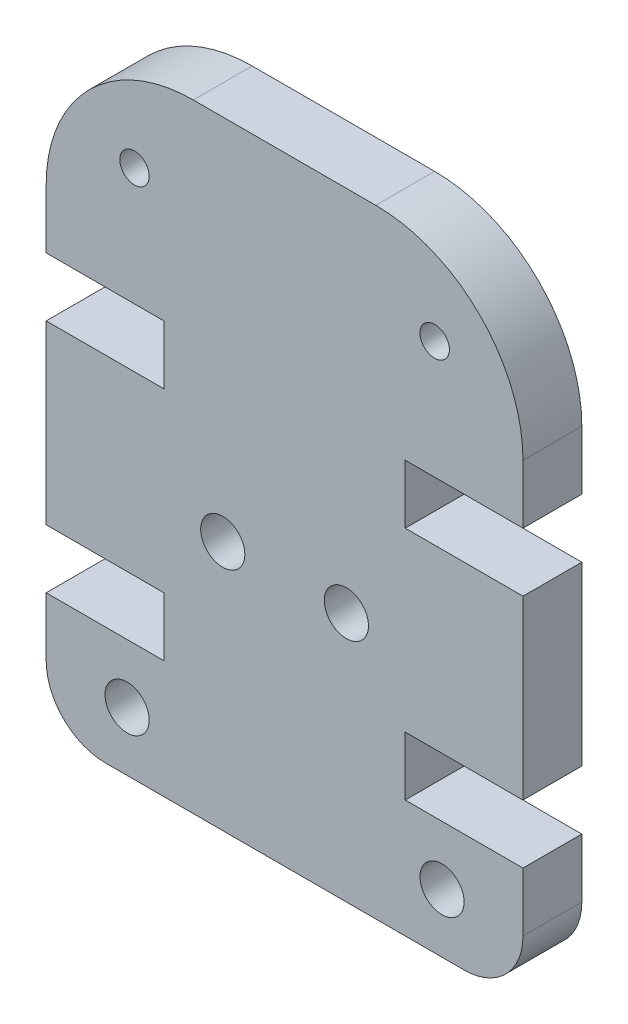
ISO-10303-21;
HEADER;
FILE_DESCRIPTION(('STEP AP214'),'2;1');
FILE_NAME('part.step','',(''),(''),'','','');
FILE_SCHEMA(('AUTOMOTIVE_DESIGN { 1 0 10303 214 1 1 1 1 }'));
ENDSEC;
DATA;
#1=APPLICATION_CONTEXT('core data for automotive mechanical design processes');
#2=APPLICATION_PROTOCOL_DEFINITION('international standard','automotive_design',2000,#1);
#3=PRODUCT_CONTEXT('',#1,'mechanical');
#4=PRODUCT('Part','Part','',(#3));
#5=PRODUCT_RELATED_PRODUCT_CATEGORY('part','',(#4));
#6=PRODUCT_DEFINITION_FORMATION('','',#4);
#7=PRODUCT_DEFINITION_CONTEXT('part definition',#1,'design');
#8=PRODUCT_DEFINITION('design','',#6,#7);
#9=PRODUCT_DEFINITION_SHAPE('','',#8);
#10=(LENGTH_UNIT() NAMED_UNIT(*) SI_UNIT(.MILLI.,.METRE.));
#11=(NAMED_UNIT(*) PLANE_ANGLE_UNIT() SI_UNIT($,.RADIAN.));
#12=(NAMED_UNIT(*) SI_UNIT($,.STERADIAN.) SOLID_ANGLE_UNIT());
#13=UNCERTAINTY_MEASURE_WITH_UNIT(LENGTH_MEASURE(1.E-05),#10,'distance_accuracy_value','');
#14=(GEOMETRIC_REPRESENTATION_CONTEXT(3) GLOBAL_UNCERTAINTY_ASSIGNED_CONTEXT((#13)) GLOBAL_UNIT_ASSIGNED_CONTEXT((#10,
#11,#12)) REPRESENTATION_CONTEXT('',''));
#15=CARTESIAN_POINT('',(0.,0.,0.));
#16=DIRECTION('',(0.,0.,1.));
#17=DIRECTION('',(1.,0.,0.));
#18=AXIS2_PLACEMENT_3D('',#15,#16,#17);
#19=CARTESIAN_POINT('',(5.00000000000002,16.,2.));
#20=DIRECTION('',(0.,0.,1.));
#21=DIRECTION('',(1.,0.,0.));
#22=AXIS2_PLACEMENT_3D('',#19,#20,#21);
#23=PLANE('',#22);
#24=CARTESIAN_POINT('',(13.4500000000022,1.99999999999781,2.));
#25=DIRECTION('',(0.,0.,1.));
#26=DIRECTION('',(1.,0.,0.));
#27=AXIS2_PLACEMENT_3D('',#24,#25,#26);
#28=CIRCLE('',#27,0.75);
#29=CARTESIAN_POINT('',(14.2000000000022,1.99999999999781,2.));
#30=VERTEX_POINT('',#29);
#31=EDGE_CURVE('E455',#30,#30,#28,.T.);
#32=ORIENTED_EDGE('',*,*,#31,.F.);
#33=EDGE_LOOP('',(#32));
#34=FACE_BOUND('',#33,.T.);
#35=CARTESIAN_POINT('',(3.00000000000103,17.9999999999999,2.));
#36=DIRECTION('',(0.,0.,1.));
#37=DIRECTION('',(1.,0.,0.));
#38=AXIS2_PLACEMENT_3D('',#35,#36,#37);
#39=CIRCLE('',#38,0.499999999999945);
#40=CARTESIAN_POINT('',(3.50000000000097,17.9999999999999,2.));
#41=VERTEX_POINT('',#40);
#42=EDGE_CURVE('E467',#41,#41,#39,.T.);
#43=ORIENTED_EDGE('',*,*,#42,.F.);
#44=EDGE_LOOP('',(#43));
#45=FACE_BOUND('',#44,.T.);
#46=CARTESIAN_POINT('',(10.2000000000012,8.5000000000022,2.));
#47=DIRECTION('',(0.,0.,1.));
#48=DIRECTION('',(1.,0.,0.));
#49=AXIS2_PLACEMENT_3D('',#46,#47,#48);
#50=CIRCLE('',#49,0.75);
#51=CARTESIAN_POINT('',(10.9500000000012,8.5000000000022,2.));
#52=VERTEX_POINT('',#51);
#53=EDGE_CURVE('E229',#52,#52,#50,.T.);
#54=ORIENTED_EDGE('',*,*,#53,.F.);
#55=EDGE_LOOP('',(#54));
#56=FACE_BOUND('',#55,.T.);
#57=CARTESIAN_POINT('',(5.00000000000002,16.,2.));
#58=DIRECTION('',(0.,0.,1.));
#59=DIRECTION('',(1.,0.,0.));
#60=AXIS2_PLACEMENT_3D('',#57,#58,#59);
#61=CIRCLE('',#60,5.00000000000001);
#62=CARTESIAN_POINT('',(5.00000000000006,21.,2.));
#63=VERTEX_POINT('',#62);
#64=CARTESIAN_POINT('',(0.,16.,2.));
#65=VERTEX_POINT('',#64);
#66=EDGE_CURVE('E272',#63,#65,#61,.T.);
#67=ORIENTED_EDGE('',*,*,#66,.T.);
#68=DIRECTION('',(0.,-1.,0.));
#69=VECTOR('',#68,1.);
#70=CARTESIAN_POINT('',(0.,16.,2.));
#71=LINE('',#70,#69);
#72=CARTESIAN_POINT('',(0.,14.,2.));
#73=VERTEX_POINT('',#72);
#74=EDGE_CURVE('E140',#65,#73,#71,.T.);
#75=ORIENTED_EDGE('',*,*,#74,.T.);
#76=DIRECTION('',(1.,0.,0.));
#77=VECTOR('',#76,1.);
#78=CARTESIAN_POINT('',(0.,14.,2.));
#79=LINE('',#78,#77);
#80=CARTESIAN_POINT('',(4.00000000000113,14.,2.));
#81=VERTEX_POINT('',#80);
#82=EDGE_CURVE('E335',#73,#81,#79,.T.);
#83=ORIENTED_EDGE('',*,*,#82,.T.);
#84=DIRECTION('',(0.,-1.,0.));
#85=VECTOR('',#84,1.);
#86=CARTESIAN_POINT('',(4.00000000000113,14.,2.));
#87=LINE('',#86,#85);
#88=CARTESIAN_POINT('',(4.00000000000113,12.,2.));
#89=VERTEX_POINT('',#88);
#90=EDGE_CURVE('E354',#81,#89,#87,.T.);
#91=ORIENTED_EDGE('',*,*,#90,.T.);
#92=DIRECTION('',(-1.,0.,0.));
#93=VECTOR('',#92,1.);
#94=CARTESIAN_POINT('',(4.00000000000113,12.,2.));
#95=LINE('',#94,#93);
#96=CARTESIAN_POINT('',(0.,12.,2.));
#97=VERTEX_POINT('',#96);
#98=EDGE_CURVE('E351',#89,#97,#95,.T.);
#99=ORIENTED_EDGE('',*,*,#98,.T.);
#100=DIRECTION('',(0.,-1.,0.));
#101=VECTOR('',#100,1.);
#102=CARTESIAN_POINT('',(0.,12.,2.));
#103=LINE('',#102,#101);
#104=CARTESIAN_POINT('',(0.,5.99999999999998,2.));
#105=VERTEX_POINT('',#104);
#106=EDGE_CURVE('E353',#97,#105,#103,.T.);
#107=ORIENTED_EDGE('',*,*,#106,.T.);
#108=DIRECTION('',(1.,0.,0.));
#109=VECTOR('',#108,1.);
#110=CARTESIAN_POINT('',(0.,5.99999999999998,2.));
#111=LINE('',#110,#109);
#112=CARTESIAN_POINT('',(4.00000000000112,5.99999999999998,2.));
#113=VERTEX_POINT('',#112);
#114=EDGE_CURVE('E356',#105,#113,#111,.T.);
#115=ORIENTED_EDGE('',*,*,#114,.T.);
#116=DIRECTION('',(0.,-1.,0.));
#117=VECTOR('',#116,1.);
#118=CARTESIAN_POINT('',(4.00000000000112,5.99999999999998,2.));
#119=LINE('',#118,#117);
#120=CARTESIAN_POINT('',(4.00000000000112,3.99999999999998,2.));
#121=VERTEX_POINT('',#120);
#122=EDGE_CURVE('E362',#113,#121,#119,.T.);
#123=ORIENTED_EDGE('',*,*,#122,.T.);
#124=DIRECTION('',(-1.,0.,0.));
#125=VECTOR('',#124,1.);
#126=CARTESIAN_POINT('',(4.00000000000112,3.99999999999998,2.));
#127=LINE('',#126,#125);
#128=CARTESIAN_POINT('',(0.,3.99999999999998,2.));
#129=VERTEX_POINT('',#128);
#130=EDGE_CURVE('E364',#121,#129,#127,.T.);
#131=ORIENTED_EDGE('',*,*,#130,.T.);
#132=DIRECTION('',(0.,-1.,0.));
#133=VECTOR('',#132,1.);
#134=CARTESIAN_POINT('',(0.,1.99999999999997,2.));
#135=LINE('',#134,#133);
#136=CARTESIAN_POINT('',(0.,1.99999999999997,2.));
#137=VERTEX_POINT('',#136);
#138=EDGE_CURVE('E366',#129,#137,#135,.T.);
#139=ORIENTED_EDGE('',*,*,#138,.T.);
#140=CARTESIAN_POINT('',(2.00000000000001,1.99999999999997,2.));
#141=DIRECTION('',(0.,0.,1.));
#142=DIRECTION('',(1.,0.,0.));
#143=AXIS2_PLACEMENT_3D('',#140,#141,#142);
#144=CIRCLE('',#143,1.99999999999999);
#145=CARTESIAN_POINT('',(2.,0.,2.));
#146=VERTEX_POINT('',#145);
#147=EDGE_CURVE('E368',#137,#146,#144,.T.);
#148=ORIENTED_EDGE('',*,*,#147,.T.);
#149=DIRECTION('',(1.,0.,0.));
#150=VECTOR('',#149,1.);
#151=CARTESIAN_POINT('',(2.,0.,2.));
#152=LINE('',#151,#150);
#153=CARTESIAN_POINT('',(14.2000000000059,0.,2.));
#154=VERTEX_POINT('',#153);
#155=EDGE_CURVE('E370',#146,#154,#152,.T.);
#156=ORIENTED_EDGE('',*,*,#155,.T.);
#157=CARTESIAN_POINT('',(14.2000000000108,1.99999999999995,2.));
#158=DIRECTION('',(0.,0.,1.));
#159=DIRECTION('',(1.,0.,0.));
#160=AXIS2_PLACEMENT_3D('',#157,#158,#159);
#161=CIRCLE('',#160,1.99999999999997);
#162=CARTESIAN_POINT('',(16.2000000000107,1.99999999999975,2.));
#163=VERTEX_POINT('',#162);
#164=EDGE_CURVE('E372',#154,#163,#161,.T.);
#165=ORIENTED_EDGE('',*,*,#164,.T.);
#166=DIRECTION('',(0.,1.,0.));
#167=VECTOR('',#166,1.);
#168=CARTESIAN_POINT('',(16.2000000000107,1.99999999999975,2.));
#169=LINE('',#168,#167);
#170=CARTESIAN_POINT('',(16.2000000000107,3.99999999999998,2.));
#171=VERTEX_POINT('',#170);
#172=EDGE_CURVE('E374',#163,#171,#169,.T.);
#173=ORIENTED_EDGE('',*,*,#172,.T.);
#174=DIRECTION('',(-1.,0.,0.));
#175=VECTOR('',#174,1.);
#176=CARTESIAN_POINT('',(12.2000000000096,3.99999999999998,2.));
#177=LINE('',#176,#175);
#178=CARTESIAN_POINT('',(12.2000000000096,3.99999999999998,2.));
#179=VERTEX_POINT('',#178);
#180=EDGE_CURVE('E376',#171,#179,#177,.T.);
#181=ORIENTED_EDGE('',*,*,#180,.T.);
#182=DIRECTION('',(0.,1.,0.));
#183=VECTOR('',#182,1.);
#184=CARTESIAN_POINT('',(12.2000000000096,5.99999999999995,2.));
#185=LINE('',#184,#183);
#186=CARTESIAN_POINT('',(12.2000000000096,5.99999999999995,2.));
#187=VERTEX_POINT('',#186);
#188=EDGE_CURVE('E378',#179,#187,#185,.T.);
#189=ORIENTED_EDGE('',*,*,#188,.T.);
#190=DIRECTION('',(1.,0.,0.));
#191=VECTOR('',#190,1.);
#192=CARTESIAN_POINT('',(16.2000000000028,5.99999999999995,2.));
#193=LINE('',#192,#191);
#194=CARTESIAN_POINT('',(16.2000000000028,5.99999999999995,2.));
#195=VERTEX_POINT('',#194);
#196=EDGE_CURVE('E380',#187,#195,#193,.T.);
#197=ORIENTED_EDGE('',*,*,#196,.T.);
#198=DIRECTION('',(0.,1.,0.));
#199=VECTOR('',#198,1.);
#200=CARTESIAN_POINT('',(16.2000000000028,12.,2.));
#201=LINE('',#200,#199);
#202=CARTESIAN_POINT('',(16.2000000000028,12.,2.));
#203=VERTEX_POINT('',#202);
#204=EDGE_CURVE('E382',#195,#203,#201,.T.);
#205=ORIENTED_EDGE('',*,*,#204,.T.);
#206=DIRECTION('',(-1.,0.,0.));
#207=VECTOR('',#206,1.);
#208=CARTESIAN_POINT('',(12.200000000003,12.,2.));
#209=LINE('',#208,#207);
#210=CARTESIAN_POINT('',(12.200000000003,12.,2.));
#211=VERTEX_POINT('',#210);
#212=EDGE_CURVE('E384',#203,#211,#209,.T.);
#213=ORIENTED_EDGE('',*,*,#212,.T.);
#214=DIRECTION('',(0.,1.,0.));
#215=VECTOR('',#214,1.);
#216=CARTESIAN_POINT('',(12.200000000003,14.,2.));
#217=LINE('',#216,#215);
#218=CARTESIAN_POINT('',(12.200000000003,14.,2.));
#219=VERTEX_POINT('',#218);
#220=EDGE_CURVE('E386',#211,#219,#217,.T.);
#221=ORIENTED_EDGE('',*,*,#220,.T.);
#222=DIRECTION('',(1.,0.,0.));
#223=VECTOR('',#222,1.);
#224=CARTESIAN_POINT('',(16.2000000000028,14.,2.));
#225=LINE('',#224,#223);
#226=CARTESIAN_POINT('',(16.2000000000028,14.,2.));
#227=VERTEX_POINT('',#226);
#228=EDGE_CURVE('E207',#219,#227,#225,.T.);
#229=ORIENTED_EDGE('',*,*,#228,.T.);
#230=DIRECTION('',(0.,1.,0.));
#231=VECTOR('',#230,1.);
#232=CARTESIAN_POINT('',(16.2000000000028,16.0000000000002,2.));
#233=LINE('',#232,#231);
#234=CARTESIAN_POINT('',(16.2000000000028,16.0000000000002,2.));
#235=VERTEX_POINT('',#234);
#236=EDGE_CURVE('E201',#227,#235,#233,.T.);
#237=ORIENTED_EDGE('',*,*,#236,.T.);
#238=CARTESIAN_POINT('',(11.2000000000015,15.9999999999986,2.));
#239=DIRECTION('',(0.,0.,1.));
#240=DIRECTION('',(1.,0.,0.));
#241=AXIS2_PLACEMENT_3D('',#238,#239,#240);
#242=CIRCLE('',#241,5.00000000000135);
#243=CARTESIAN_POINT('',(11.2000000000028,21.,2.));
#244=VERTEX_POINT('',#243);
#245=EDGE_CURVE('E205',#235,#244,#242,.T.);
#246=ORIENTED_EDGE('',*,*,#245,.T.);
#247=DIRECTION('',(-1.,0.,0.));
#248=VECTOR('',#247,1.);
#249=CARTESIAN_POINT('',(5.00000000000006,21.,2.));
#250=LINE('',#249,#248);
#251=EDGE_CURVE('E49',#244,#63,#250,.T.);
#252=ORIENTED_EDGE('',*,*,#251,.T.);
#253=EDGE_LOOP('',(#67,#75,#83,#91,#99,#107,#115,#123,#131,#139,#148,#156,#165,#173,#181,#189,
#197,#205,#213,#221,#229,#237,#246,#252));
#254=FACE_BOUND('',#253,.T.);
#255=CARTESIAN_POINT('',(6.00000000000113,8.5000000000022,2.));
#256=DIRECTION('',(0.,0.,1.));
#257=DIRECTION('',(1.,0.,0.));
#258=AXIS2_PLACEMENT_3D('',#255,#256,#257);
#259=CIRCLE('',#258,0.75);
#260=CARTESIAN_POINT('',(6.75000000000113,8.5000000000022,2.));
#261=VERTEX_POINT('',#260);
#262=EDGE_CURVE('E473',#261,#261,#259,.T.);
#263=ORIENTED_EDGE('',*,*,#262,.F.);
#264=EDGE_LOOP('',(#263));
#265=FACE_BOUND('',#264,.T.);
#266=CARTESIAN_POINT('',(13.2000000000014,17.9999999999999,2.));
#267=DIRECTION('',(0.,0.,1.));
#268=DIRECTION('',(1.,0.,0.));
#269=AXIS2_PLACEMENT_3D('',#266,#267,#268);
#270=CIRCLE('',#269,0.500000000000167);
#271=CARTESIAN_POINT('',(13.7000000000015,17.9999999999999,2.));
#272=VERTEX_POINT('',#271);
#273=EDGE_CURVE('E461',#272,#272,#270,.T.);
#274=ORIENTED_EDGE('',*,*,#273,.F.);
#275=EDGE_LOOP('',(#274));
#276=FACE_BOUND('',#275,.T.);
#277=CARTESIAN_POINT('',(2.75000000000094,2.00000000000014,2.));
#278=DIRECTION('',(0.,0.,1.));
#279=DIRECTION('',(1.,0.,0.));
#280=AXIS2_PLACEMENT_3D('',#277,#278,#279);
#281=CIRCLE('',#280,0.75);
#282=CARTESIAN_POINT('',(3.50000000000094,2.00000000000014,2.));
#283=VERTEX_POINT('',#282);
#284=EDGE_CURVE('E446',#283,#283,#281,.T.);
#285=ORIENTED_EDGE('',*,*,#284,.F.);
#286=EDGE_LOOP('',(#285));
#287=FACE_BOUND('',#286,.T.);
#288=ADVANCED_FACE('F32',(#34,#45,#56,#254,#265,#276,#287),#23,.T.);
#289=CARTESIAN_POINT('',(5.00000000000002,16.,0.));
#290=DIRECTION('',(0.,0.,1.));
#291=DIRECTION('',(1.,0.,0.));
#292=AXIS2_PLACEMENT_3D('',#289,#290,#291);
#293=PLANE('',#292);
#294=CARTESIAN_POINT('',(13.4500000000022,1.99999999999781,0.));
#295=DIRECTION('',(0.,0.,1.));
#296=DIRECTION('',(1.,0.,0.));
#297=AXIS2_PLACEMENT_3D('',#294,#295,#296);
#298=CIRCLE('',#297,0.75);
#299=CARTESIAN_POINT('',(14.2000000000022,1.99999999999781,0.));
#300=VERTEX_POINT('',#299);
#301=EDGE_CURVE('E452',#300,#300,#298,.T.);
#302=ORIENTED_EDGE('',*,*,#301,.T.);
#303=EDGE_LOOP('',(#302));
#304=FACE_BOUND('',#303,.T.);
#305=CARTESIAN_POINT('',(3.00000000000103,17.9999999999999,0.));
#306=DIRECTION('',(0.,0.,1.));
#307=DIRECTION('',(1.,0.,0.));
#308=AXIS2_PLACEMENT_3D('',#305,#306,#307);
#309=CIRCLE('',#308,0.499999999999945);
#310=CARTESIAN_POINT('',(3.50000000000097,17.9999999999999,0.));
#311=VERTEX_POINT('',#310);
#312=EDGE_CURVE('E464',#311,#311,#309,.T.);
#313=ORIENTED_EDGE('',*,*,#312,.T.);
#314=EDGE_LOOP('',(#313));
#315=FACE_BOUND('',#314,.T.);
#316=CARTESIAN_POINT('',(10.2000000000012,8.5000000000022,0.));
#317=DIRECTION('',(0.,0.,1.));
#318=DIRECTION('',(1.,0.,0.));
#319=AXIS2_PLACEMENT_3D('',#316,#317,#318);
#320=CIRCLE('',#319,0.75);
#321=CARTESIAN_POINT('',(10.9500000000012,8.5000000000022,0.));
#322=VERTEX_POINT('',#321);
#323=EDGE_CURVE('E476',#322,#322,#320,.T.);
#324=ORIENTED_EDGE('',*,*,#323,.T.);
#325=EDGE_LOOP('',(#324));
#326=FACE_BOUND('',#325,.T.);
#327=CARTESIAN_POINT('',(5.00000000000002,16.,0.));
#328=DIRECTION('',(0.,0.,1.));
#329=DIRECTION('',(1.,0.,0.));
#330=AXIS2_PLACEMENT_3D('',#327,#328,#329);
#331=CIRCLE('',#330,5.00000000000001);
#332=CARTESIAN_POINT('',(5.00000000000006,21.,0.));
#333=VERTEX_POINT('',#332);
#334=CARTESIAN_POINT('',(0.,16.,0.));
#335=VERTEX_POINT('',#334);
#336=EDGE_CURVE('E225',#333,#335,#331,.T.);
#337=ORIENTED_EDGE('',*,*,#336,.F.);
#338=DIRECTION('',(-1.,0.,0.));
#339=VECTOR('',#338,1.);
#340=CARTESIAN_POINT('',(5.00000000000006,21.,0.));
#341=LINE('',#340,#339);
#342=CARTESIAN_POINT('',(11.2000000000028,21.,0.));
#343=VERTEX_POINT('',#342);
#344=EDGE_CURVE('E132',#343,#333,#341,.T.);
#345=ORIENTED_EDGE('',*,*,#344,.F.);
#346=CARTESIAN_POINT('',(11.2000000000015,15.9999999999986,0.));
#347=DIRECTION('',(0.,0.,1.));
#348=DIRECTION('',(1.,0.,0.));
#349=AXIS2_PLACEMENT_3D('',#346,#347,#348);
#350=CIRCLE('',#349,5.00000000000135);
#351=CARTESIAN_POINT('',(16.2000000000028,16.0000000000002,0.));
#352=VERTEX_POINT('',#351);
#353=EDGE_CURVE('E126',#352,#343,#350,.T.);
#354=ORIENTED_EDGE('',*,*,#353,.F.);
#355=DIRECTION('',(0.,1.,0.));
#356=VECTOR('',#355,1.);
#357=CARTESIAN_POINT('',(16.2000000000028,16.0000000000002,0.));
#358=LINE('',#357,#356);
#359=CARTESIAN_POINT('',(16.2000000000028,14.,0.));
#360=VERTEX_POINT('',#359);
#361=EDGE_CURVE('E215',#360,#352,#358,.T.);
#362=ORIENTED_EDGE('',*,*,#361,.F.);
#363=DIRECTION('',(1.,0.,0.));
#364=VECTOR('',#363,1.);
#365=CARTESIAN_POINT('',(16.2000000000028,14.,0.));
#366=LINE('',#365,#364);
#367=CARTESIAN_POINT('',(12.200000000003,14.,0.));
#368=VERTEX_POINT('',#367);
#369=EDGE_CURVE('E267',#368,#360,#366,.T.);
#370=ORIENTED_EDGE('',*,*,#369,.F.);
#371=DIRECTION('',(0.,1.,0.));
#372=VECTOR('',#371,1.);
#373=CARTESIAN_POINT('',(12.200000000003,14.,0.));
#374=LINE('',#373,#372);
#375=CARTESIAN_POINT('',(12.200000000003,12.,0.));
#376=VERTEX_POINT('',#375);
#377=EDGE_CURVE('E265',#376,#368,#374,.T.);
#378=ORIENTED_EDGE('',*,*,#377,.F.);
#379=DIRECTION('',(-1.,0.,0.));
#380=VECTOR('',#379,1.);
#381=CARTESIAN_POINT('',(12.200000000003,12.,0.));
#382=LINE('',#381,#380);
#383=CARTESIAN_POINT('',(16.2000000000028,12.,0.));
#384=VERTEX_POINT('',#383);
#385=EDGE_CURVE('E263',#384,#376,#382,.T.);
#386=ORIENTED_EDGE('',*,*,#385,.F.);
#387=DIRECTION('',(0.,1.,0.));
#388=VECTOR('',#387,1.);
#389=CARTESIAN_POINT('',(16.2000000000028,12.,0.));
#390=LINE('',#389,#388);
#391=CARTESIAN_POINT('',(16.2000000000028,5.99999999999995,0.));
#392=VERTEX_POINT('',#391);
#393=EDGE_CURVE('E261',#392,#384,#390,.T.);
#394=ORIENTED_EDGE('',*,*,#393,.F.);
#395=DIRECTION('',(1.,0.,0.));
#396=VECTOR('',#395,1.);
#397=CARTESIAN_POINT('',(16.2000000000028,5.99999999999995,0.));
#398=LINE('',#397,#396);
#399=CARTESIAN_POINT('',(12.2000000000096,5.99999999999995,0.));
#400=VERTEX_POINT('',#399);
#401=EDGE_CURVE('E259',#400,#392,#398,.T.);
#402=ORIENTED_EDGE('',*,*,#401,.F.);
#403=DIRECTION('',(0.,1.,0.));
#404=VECTOR('',#403,1.);
#405=CARTESIAN_POINT('',(12.2000000000096,5.99999999999995,0.));
#406=LINE('',#405,#404);
#407=CARTESIAN_POINT('',(12.2000000000096,3.99999999999998,0.));
#408=VERTEX_POINT('',#407);
#409=EDGE_CURVE('E257',#408,#400,#406,.T.);
#410=ORIENTED_EDGE('',*,*,#409,.F.);
#411=DIRECTION('',(-1.,0.,0.));
#412=VECTOR('',#411,1.);
#413=CARTESIAN_POINT('',(12.2000000000096,3.99999999999998,0.));
#414=LINE('',#413,#412);
#415=CARTESIAN_POINT('',(16.2000000000107,3.99999999999998,0.));
#416=VERTEX_POINT('',#415);
#417=EDGE_CURVE('E255',#416,#408,#414,.T.);
#418=ORIENTED_EDGE('',*,*,#417,.F.);
#419=DIRECTION('',(0.,1.,0.));
#420=VECTOR('',#419,1.);
#421=CARTESIAN_POINT('',(16.2000000000107,1.99999999999975,0.));
#422=LINE('',#421,#420);
#423=CARTESIAN_POINT('',(16.2000000000107,1.99999999999975,0.));
#424=VERTEX_POINT('',#423);
#425=EDGE_CURVE('E253',#424,#416,#422,.T.);
#426=ORIENTED_EDGE('',*,*,#425,.F.);
#427=CARTESIAN_POINT('',(14.2000000000108,1.99999999999995,0.));
#428=DIRECTION('',(0.,0.,1.));
#429=DIRECTION('',(1.,0.,0.));
#430=AXIS2_PLACEMENT_3D('',#427,#428,#429);
#431=CIRCLE('',#430,1.99999999999997);
#432=CARTESIAN_POINT('',(14.2000000000059,0.,0.));
#433=VERTEX_POINT('',#432);
#434=EDGE_CURVE('E251',#433,#424,#431,.T.);
#435=ORIENTED_EDGE('',*,*,#434,.F.);
#436=DIRECTION('',(1.,0.,0.));
#437=VECTOR('',#436,1.);
#438=CARTESIAN_POINT('',(2.,0.,0.));
#439=LINE('',#438,#437);
#440=CARTESIAN_POINT('',(2.,0.,0.));
#441=VERTEX_POINT('',#440);
#442=EDGE_CURVE('E249',#441,#433,#439,.T.);
#443=ORIENTED_EDGE('',*,*,#442,.F.);
#444=CARTESIAN_POINT('',(2.00000000000001,1.99999999999997,0.));
#445=DIRECTION('',(0.,0.,1.));
#446=DIRECTION('',(1.,0.,0.));
#447=AXIS2_PLACEMENT_3D('',#444,#445,#446);
#448=CIRCLE('',#447,1.99999999999999);
#449=CARTESIAN_POINT('',(0.,1.99999999999997,0.));
#450=VERTEX_POINT('',#449);
#451=EDGE_CURVE('E247',#450,#441,#448,.T.);
#452=ORIENTED_EDGE('',*,*,#451,.F.);
#453=DIRECTION('',(0.,-1.,0.));
#454=VECTOR('',#453,1.);
#455=CARTESIAN_POINT('',(0.,1.99999999999997,0.));
#456=LINE('',#455,#454);
#457=CARTESIAN_POINT('',(0.,3.99999999999998,0.));
#458=VERTEX_POINT('',#457);
#459=EDGE_CURVE('E245',#458,#450,#456,.T.);
#460=ORIENTED_EDGE('',*,*,#459,.F.);
#461=DIRECTION('',(-1.,0.,0.));
#462=VECTOR('',#461,1.);
#463=CARTESIAN_POINT('',(4.00000000000112,3.99999999999998,0.));
#464=LINE('',#463,#462);
#465=CARTESIAN_POINT('',(4.00000000000112,3.99999999999998,0.));
#466=VERTEX_POINT('',#465);
#467=EDGE_CURVE('E243',#466,#458,#464,.T.);
#468=ORIENTED_EDGE('',*,*,#467,.F.);
#469=DIRECTION('',(0.,-1.,0.));
#470=VECTOR('',#469,1.);
#471=CARTESIAN_POINT('',(4.00000000000112,5.99999999999998,0.));
#472=LINE('',#471,#470);
#473=CARTESIAN_POINT('',(4.00000000000112,5.99999999999998,0.));
#474=VERTEX_POINT('',#473);
#475=EDGE_CURVE('E241',#474,#466,#472,.T.);
#476=ORIENTED_EDGE('',*,*,#475,.F.);
#477=DIRECTION('',(1.,0.,0.));
#478=VECTOR('',#477,1.);
#479=CARTESIAN_POINT('',(0.,5.99999999999998,0.));
#480=LINE('',#479,#478);
#481=CARTESIAN_POINT('',(0.,5.99999999999998,0.));
#482=VERTEX_POINT('',#481);
#483=EDGE_CURVE('E239',#482,#474,#480,.T.);
#484=ORIENTED_EDGE('',*,*,#483,.F.);
#485=DIRECTION('',(0.,-1.,0.));
#486=VECTOR('',#485,1.);
#487=CARTESIAN_POINT('',(0.,12.,0.));
#488=LINE('',#487,#486);
#489=CARTESIAN_POINT('',(0.,12.,0.));
#490=VERTEX_POINT('',#489);
#491=EDGE_CURVE('E237',#490,#482,#488,.T.);
#492=ORIENTED_EDGE('',*,*,#491,.F.);
#493=DIRECTION('',(-1.,0.,0.));
#494=VECTOR('',#493,1.);
#495=CARTESIAN_POINT('',(4.00000000000113,12.,0.));
#496=LINE('',#495,#494);
#497=CARTESIAN_POINT('',(4.00000000000113,12.,0.));
#498=VERTEX_POINT('',#497);
#499=EDGE_CURVE('E235',#498,#490,#496,.T.);
#500=ORIENTED_EDGE('',*,*,#499,.F.);
#501=DIRECTION('',(0.,-1.,0.));
#502=VECTOR('',#501,1.);
#503=CARTESIAN_POINT('',(4.00000000000113,14.,0.));
#504=LINE('',#503,#502);
#505=CARTESIAN_POINT('',(4.00000000000113,14.,0.));
#506=VERTEX_POINT('',#505);
#507=EDGE_CURVE('E233',#506,#498,#504,.T.);
#508=ORIENTED_EDGE('',*,*,#507,.F.);
#509=DIRECTION('',(1.,0.,0.));
#510=VECTOR('',#509,1.);
#511=CARTESIAN_POINT('',(0.,14.,0.));
#512=LINE('',#511,#510);
#513=CARTESIAN_POINT('',(0.,14.,0.));
#514=VERTEX_POINT('',#513);
#515=EDGE_CURVE('E231',#514,#506,#512,.T.);
#516=ORIENTED_EDGE('',*,*,#515,.F.);
#517=DIRECTION('',(0.,-1.,0.));
#518=VECTOR('',#517,1.);
#519=CARTESIAN_POINT('',(0.,16.,0.));
#520=LINE('',#519,#518);
#521=EDGE_CURVE('E228',#335,#514,#520,.T.);
#522=ORIENTED_EDGE('',*,*,#521,.F.);
#523=EDGE_LOOP('',(#337,#345,#354,#362,#370,#378,#386,#394,#402,#410,#418,#426,#435,#443,#452,
#460,#468,#476,#484,#492,#500,#508,#516,#522));
#524=FACE_BOUND('',#523,.T.);
#525=CARTESIAN_POINT('',(6.00000000000113,8.5000000000022,0.));
#526=DIRECTION('',(0.,0.,1.));
#527=DIRECTION('',(1.,0.,0.));
#528=AXIS2_PLACEMENT_3D('',#525,#526,#527);
#529=CIRCLE('',#528,0.75);
#530=CARTESIAN_POINT('',(6.75000000000113,8.5000000000022,0.));
#531=VERTEX_POINT('',#530);
#532=EDGE_CURVE('E470',#531,#531,#529,.T.);
#533=ORIENTED_EDGE('',*,*,#532,.T.);
#534=EDGE_LOOP('',(#533));
#535=FACE_BOUND('',#534,.T.);
#536=CARTESIAN_POINT('',(13.2000000000014,17.9999999999999,0.));
#537=DIRECTION('',(0.,0.,1.));
#538=DIRECTION('',(1.,0.,0.));
#539=AXIS2_PLACEMENT_3D('',#536,#537,#538);
#540=CIRCLE('',#539,0.500000000000167);
#541=CARTESIAN_POINT('',(13.7000000000015,17.9999999999999,0.));
#542=VERTEX_POINT('',#541);
#543=EDGE_CURVE('E458',#542,#542,#540,.T.);
#544=ORIENTED_EDGE('',*,*,#543,.T.);
#545=EDGE_LOOP('',(#544));
#546=FACE_BOUND('',#545,.T.);
#547=CARTESIAN_POINT('',(2.75000000000094,2.00000000000014,0.));
#548=DIRECTION('',(0.,0.,1.));
#549=DIRECTION('',(1.,0.,0.));
#550=AXIS2_PLACEMENT_3D('',#547,#548,#549);
#551=CIRCLE('',#550,0.75);
#552=CARTESIAN_POINT('',(3.50000000000094,2.00000000000014,0.));
#553=VERTEX_POINT('',#552);
#554=EDGE_CURVE('E449',#553,#553,#551,.T.);
#555=ORIENTED_EDGE('',*,*,#554,.T.);
#556=EDGE_LOOP('',(#555));
#557=FACE_BOUND('',#556,.T.);
#558=ADVANCED_FACE('F339',(#304,#315,#326,#524,#535,#546,#557),#293,.F.);
#559=CARTESIAN_POINT('',(5.00000000000002,16.,2.));
#560=DIRECTION('',(0.,0.,-1.));
#561=DIRECTION('',(-1.,0.,0.));
#562=AXIS2_PLACEMENT_3D('',#559,#560,#561);
#563=CYLINDRICAL_SURFACE('',#562,5.00000000000001);
#564=ORIENTED_EDGE('',*,*,#336,.T.);
#565=DIRECTION('',(0.,0.,-1.));
#566=VECTOR('',#565,1.);
#567=CARTESIAN_POINT('',(0.,16.,2.));
#568=LINE('',#567,#566);
#569=EDGE_CURVE('E11',#65,#335,#568,.T.);
#570=ORIENTED_EDGE('',*,*,#569,.F.);
#571=ORIENTED_EDGE('',*,*,#66,.F.);
#572=DIRECTION('',(0.,0.,-1.));
#573=VECTOR('',#572,1.);
#574=CARTESIAN_POINT('',(5.00000000000006,21.,2.));
#575=LINE('',#574,#573);
#576=EDGE_CURVE('E221',#63,#333,#575,.T.);
#577=ORIENTED_EDGE('',*,*,#576,.T.);
#578=EDGE_LOOP('',(#564,#570,#571,#577));
#579=FACE_BOUND('',#578,.T.);
#580=ADVANCED_FACE('F34',(#579),#563,.T.);
#581=CARTESIAN_POINT('',(0.,16.,2.));
#582=DIRECTION('',(1.,0.,0.));
#583=DIRECTION('',(0.,0.,-1.));
#584=AXIS2_PLACEMENT_3D('',#581,#582,#583);
#585=PLANE('',#584);
#586=ORIENTED_EDGE('',*,*,#521,.T.);
#587=DIRECTION('',(0.,0.,-1.));
#588=VECTOR('',#587,1.);
#589=CARTESIAN_POINT('',(0.,14.,2.));
#590=LINE('',#589,#588);
#591=EDGE_CURVE('E41',#73,#514,#590,.T.);
#592=ORIENTED_EDGE('',*,*,#591,.F.);
#593=ORIENTED_EDGE('',*,*,#74,.F.);
#594=ORIENTED_EDGE('',*,*,#569,.T.);
#595=EDGE_LOOP('',(#586,#592,#593,#594));
#596=FACE_BOUND('',#595,.T.);
#597=ADVANCED_FACE('F723',(#596),#585,.F.);
#598=CARTESIAN_POINT('',(0.,14.,2.));
#599=DIRECTION('',(0.,1.,0.));
#600=DIRECTION('',(-1.,0.,0.));
#601=AXIS2_PLACEMENT_3D('',#598,#599,#600);
#602=PLANE('',#601);
#603=ORIENTED_EDGE('',*,*,#515,.T.);
#604=DIRECTION('',(0.,0.,-1.));
#605=VECTOR('',#604,1.);
#606=CARTESIAN_POINT('',(4.00000000000113,14.,2.));
#607=LINE('',#606,#605);
#608=EDGE_CURVE('E327',#81,#506,#607,.T.);
#609=ORIENTED_EDGE('',*,*,#608,.F.);
#610=ORIENTED_EDGE('',*,*,#82,.F.);
#611=ORIENTED_EDGE('',*,*,#591,.T.);
#612=EDGE_LOOP('',(#603,#609,#610,#611));
#613=FACE_BOUND('',#612,.T.);
#614=ADVANCED_FACE('F333',(#613),#602,.F.);
#615=CARTESIAN_POINT('',(4.00000000000113,14.,2.));
#616=DIRECTION('',(1.,0.,0.));
#617=DIRECTION('',(0.,1.,0.));
#618=AXIS2_PLACEMENT_3D('',#615,#616,#617);
#619=PLANE('',#618);
#620=ORIENTED_EDGE('',*,*,#507,.T.);
#621=DIRECTION('',(0.,0.,-1.));
#622=VECTOR('',#621,1.);
#623=CARTESIAN_POINT('',(4.00000000000113,12.,2.));
#624=LINE('',#623,#622);
#625=EDGE_CURVE('E324',#89,#498,#624,.T.);
#626=ORIENTED_EDGE('',*,*,#625,.F.);
#627=ORIENTED_EDGE('',*,*,#90,.F.);
#628=ORIENTED_EDGE('',*,*,#608,.T.);
#629=EDGE_LOOP('',(#620,#626,#627,#628));
#630=FACE_BOUND('',#629,.T.);
#631=ADVANCED_FACE('F345',(#630),#619,.F.);
#632=CARTESIAN_POINT('',(4.00000000000113,12.,2.));
#633=DIRECTION('',(0.,-1.,0.));
#634=DIRECTION('',(1.,0.,0.));
#635=AXIS2_PLACEMENT_3D('',#632,#633,#634);
#636=PLANE('',#635);
#637=ORIENTED_EDGE('',*,*,#499,.T.);
#638=DIRECTION('',(0.,0.,-1.));
#639=VECTOR('',#638,1.);
#640=CARTESIAN_POINT('',(0.,12.,2.));
#641=LINE('',#640,#639);
#642=EDGE_CURVE('E321',#97,#490,#641,.T.);
#643=ORIENTED_EDGE('',*,*,#642,.F.);
#644=ORIENTED_EDGE('',*,*,#98,.F.);
#645=ORIENTED_EDGE('',*,*,#625,.T.);
#646=EDGE_LOOP('',(#637,#643,#644,#645));
#647=FACE_BOUND('',#646,.T.);
#648=ADVANCED_FACE('F349',(#647),#636,.F.);
#649=CARTESIAN_POINT('',(0.,12.,2.));
#650=DIRECTION('',(1.,0.,0.));
#651=DIRECTION('',(0.,0.,-1.));
#652=AXIS2_PLACEMENT_3D('',#649,#650,#651);
#653=PLANE('',#652);
#654=ORIENTED_EDGE('',*,*,#491,.T.);
#655=DIRECTION('',(0.,0.,-1.));
#656=VECTOR('',#655,1.);
#657=CARTESIAN_POINT('',(0.,5.99999999999998,2.));
#658=LINE('',#657,#656);
#659=EDGE_CURVE('E318',#105,#482,#658,.T.);
#660=ORIENTED_EDGE('',*,*,#659,.F.);
#661=ORIENTED_EDGE('',*,*,#106,.F.);
#662=ORIENTED_EDGE('',*,*,#642,.T.);
#663=EDGE_LOOP('',(#654,#660,#661,#662));
#664=FACE_BOUND('',#663,.T.);
#665=ADVANCED_FACE('F688',(#664),#653,.F.);
#666=CARTESIAN_POINT('',(0.,5.99999999999998,2.));
#667=DIRECTION('',(0.,1.,0.));
#668=DIRECTION('',(0.,0.,1.));
#669=AXIS2_PLACEMENT_3D('',#666,#667,#668);
#670=PLANE('',#669);
#671=ORIENTED_EDGE('',*,*,#483,.T.);
#672=DIRECTION('',(0.,0.,-1.));
#673=VECTOR('',#672,1.);
#674=CARTESIAN_POINT('',(4.00000000000112,5.99999999999998,2.));
#675=LINE('',#674,#673);
#676=EDGE_CURVE('E315',#113,#474,#675,.T.);
#677=ORIENTED_EDGE('',*,*,#676,.F.);
#678=ORIENTED_EDGE('',*,*,#114,.F.);
#679=ORIENTED_EDGE('',*,*,#659,.T.);
#680=EDGE_LOOP('',(#671,#677,#678,#679));
#681=FACE_BOUND('',#680,.T.);
#682=ADVANCED_FACE('F678',(#681),#670,.F.);
#683=CARTESIAN_POINT('',(4.00000000000112,5.99999999999998,2.));
#684=DIRECTION('',(1.,0.,0.));
#685=DIRECTION('',(0.,0.,-1.));
#686=AXIS2_PLACEMENT_3D('',#683,#684,#685);
#687=PLANE('',#686);
#688=ORIENTED_EDGE('',*,*,#475,.T.);
#689=DIRECTION('',(0.,0.,-1.));
#690=VECTOR('',#689,1.);
#691=CARTESIAN_POINT('',(4.00000000000112,3.99999999999998,2.));
#692=LINE('',#691,#690);
#693=EDGE_CURVE('E312',#121,#466,#692,.T.);
#694=ORIENTED_EDGE('',*,*,#693,.F.);
#695=ORIENTED_EDGE('',*,*,#122,.F.);
#696=ORIENTED_EDGE('',*,*,#676,.T.);
#697=EDGE_LOOP('',(#688,#694,#695,#696));
#698=FACE_BOUND('',#697,.T.);
#699=ADVANCED_FACE('F668',(#698),#687,.F.);
#700=CARTESIAN_POINT('',(4.00000000000112,3.99999999999998,2.));
#701=DIRECTION('',(0.,-1.,0.));
#702=DIRECTION('',(0.,0.,-1.));
#703=AXIS2_PLACEMENT_3D('',#700,#701,#702);
#704=PLANE('',#703);
#705=ORIENTED_EDGE('',*,*,#467,.T.);
#706=DIRECTION('',(0.,0.,-1.));
#707=VECTOR('',#706,1.);
#708=CARTESIAN_POINT('',(0.,3.99999999999998,2.));
#709=LINE('',#708,#707);
#710=EDGE_CURVE('E309',#129,#458,#709,.T.);
#711=ORIENTED_EDGE('',*,*,#710,.F.);
#712=ORIENTED_EDGE('',*,*,#130,.F.);
#713=ORIENTED_EDGE('',*,*,#693,.T.);
#714=EDGE_LOOP('',(#705,#711,#712,#713));
#715=FACE_BOUND('',#714,.T.);
#716=ADVANCED_FACE('F658',(#715),#704,.F.);
#717=CARTESIAN_POINT('',(0.,1.99999999999997,2.));
#718=DIRECTION('',(1.,0.,0.));
#719=DIRECTION('',(0.,1.,0.));
#720=AXIS2_PLACEMENT_3D('',#717,#718,#719);
#721=PLANE('',#720);
#722=ORIENTED_EDGE('',*,*,#459,.T.);
#723=DIRECTION('',(0.,0.,-1.));
#724=VECTOR('',#723,1.);
#725=CARTESIAN_POINT('',(0.,1.99999999999997,2.));
#726=LINE('',#725,#724);
#727=EDGE_CURVE('E306',#137,#450,#726,.T.);
#728=ORIENTED_EDGE('',*,*,#727,.F.);
#729=ORIENTED_EDGE('',*,*,#138,.F.);
#730=ORIENTED_EDGE('',*,*,#710,.T.);
#731=EDGE_LOOP('',(#722,#728,#729,#730));
#732=FACE_BOUND('',#731,.T.);
#733=ADVANCED_FACE('F648',(#732),#721,.F.);
#734=CARTESIAN_POINT('',(2.00000000000001,1.99999999999997,2.));
#735=DIRECTION('',(0.,0.,-1.));
#736=DIRECTION('',(-1.,0.,0.));
#737=AXIS2_PLACEMENT_3D('',#734,#735,#736);
#738=CYLINDRICAL_SURFACE('',#737,1.99999999999999);
#739=ORIENTED_EDGE('',*,*,#451,.T.);
#740=DIRECTION('',(0.,0.,-1.));
#741=VECTOR('',#740,1.);
#742=CARTESIAN_POINT('',(2.,0.,2.));
#743=LINE('',#742,#741);
#744=EDGE_CURVE('E303',#146,#441,#743,.T.);
#745=ORIENTED_EDGE('',*,*,#744,.F.);
#746=ORIENTED_EDGE('',*,*,#147,.F.);
#747=ORIENTED_EDGE('',*,*,#727,.T.);
#748=EDGE_LOOP('',(#739,#745,#746,#747));
#749=FACE_BOUND('',#748,.T.);
#750=ADVANCED_FACE('F638',(#749),#738,.T.);
#751=CARTESIAN_POINT('',(2.,0.,2.));
#752=DIRECTION('',(0.,1.,0.));
#753=DIRECTION('',(-1.,0.,0.));
#754=AXIS2_PLACEMENT_3D('',#751,#752,#753);
#755=PLANE('',#754);
#756=ORIENTED_EDGE('',*,*,#442,.T.);
#757=DIRECTION('',(0.,0.,-1.));
#758=VECTOR('',#757,1.);
#759=CARTESIAN_POINT('',(14.2000000000059,0.,2.));
#760=LINE('',#759,#758);
#761=EDGE_CURVE('E300',#154,#433,#760,.T.);
#762=ORIENTED_EDGE('',*,*,#761,.F.);
#763=ORIENTED_EDGE('',*,*,#155,.F.);
#764=ORIENTED_EDGE('',*,*,#744,.T.);
#765=EDGE_LOOP('',(#756,#762,#763,#764));
#766=FACE_BOUND('',#765,.T.);
#767=ADVANCED_FACE('F628',(#766),#755,.F.);
#768=CARTESIAN_POINT('',(14.2000000000108,1.99999999999995,2.));
#769=DIRECTION('',(0.,0.,-1.));
#770=DIRECTION('',(-1.,0.,0.));
#771=AXIS2_PLACEMENT_3D('',#768,#769,#770);
#772=CYLINDRICAL_SURFACE('',#771,1.99999999999997);
#773=ORIENTED_EDGE('',*,*,#434,.T.);
#774=DIRECTION('',(0.,0.,-1.));
#775=VECTOR('',#774,1.);
#776=CARTESIAN_POINT('',(16.2000000000107,1.99999999999975,2.));
#777=LINE('',#776,#775);
#778=EDGE_CURVE('E297',#163,#424,#777,.T.);
#779=ORIENTED_EDGE('',*,*,#778,.F.);
#780=ORIENTED_EDGE('',*,*,#164,.F.);
#781=ORIENTED_EDGE('',*,*,#761,.T.);
#782=EDGE_LOOP('',(#773,#779,#780,#781));
#783=FACE_BOUND('',#782,.T.);
#784=ADVANCED_FACE('F618',(#783),#772,.T.);
#785=CARTESIAN_POINT('',(16.2000000000107,1.99999999999975,2.));
#786=DIRECTION('',(-1.,0.,0.));
#787=DIRECTION('',(0.,0.,1.));
#788=AXIS2_PLACEMENT_3D('',#785,#786,#787);
#789=PLANE('',#788);
#790=ORIENTED_EDGE('',*,*,#425,.T.);
#791=DIRECTION('',(0.,0.,-1.));
#792=VECTOR('',#791,1.);
#793=CARTESIAN_POINT('',(16.2000000000107,3.99999999999998,2.));
#794=LINE('',#793,#792);
#795=EDGE_CURVE('E294',#171,#416,#794,.T.);
#796=ORIENTED_EDGE('',*,*,#795,.F.);
#797=ORIENTED_EDGE('',*,*,#172,.F.);
#798=ORIENTED_EDGE('',*,*,#778,.T.);
#799=EDGE_LOOP('',(#790,#796,#797,#798));
#800=FACE_BOUND('',#799,.T.);
#801=ADVANCED_FACE('F608',(#800),#789,.F.);
#802=CARTESIAN_POINT('',(12.2000000000096,3.99999999999998,2.));
#803=DIRECTION('',(0.,-1.,0.));
#804=DIRECTION('',(0.,0.,-1.));
#805=AXIS2_PLACEMENT_3D('',#802,#803,#804);
#806=PLANE('',#805);
#807=ORIENTED_EDGE('',*,*,#417,.T.);
#808=DIRECTION('',(0.,0.,-1.));
#809=VECTOR('',#808,1.);
#810=CARTESIAN_POINT('',(12.2000000000096,3.99999999999998,2.));
#811=LINE('',#810,#809);
#812=EDGE_CURVE('E291',#179,#408,#811,.T.);
#813=ORIENTED_EDGE('',*,*,#812,.F.);
#814=ORIENTED_EDGE('',*,*,#180,.F.);
#815=ORIENTED_EDGE('',*,*,#795,.T.);
#816=EDGE_LOOP('',(#807,#813,#814,#815));
#817=FACE_BOUND('',#816,.T.);
#818=ADVANCED_FACE('F598',(#817),#806,.F.);
#819=CARTESIAN_POINT('',(12.2000000000096,5.99999999999995,2.));
#820=DIRECTION('',(-1.,0.,0.));
#821=DIRECTION('',(0.,0.,1.));
#822=AXIS2_PLACEMENT_3D('',#819,#820,#821);
#823=PLANE('',#822);
#824=ORIENTED_EDGE('',*,*,#409,.T.);
#825=DIRECTION('',(0.,0.,-1.));
#826=VECTOR('',#825,1.);
#827=CARTESIAN_POINT('',(12.2000000000096,5.99999999999995,2.));
#828=LINE('',#827,#826);
#829=EDGE_CURVE('E288',#187,#400,#828,.T.);
#830=ORIENTED_EDGE('',*,*,#829,.F.);
#831=ORIENTED_EDGE('',*,*,#188,.F.);
#832=ORIENTED_EDGE('',*,*,#812,.T.);
#833=EDGE_LOOP('',(#824,#830,#831,#832));
#834=FACE_BOUND('',#833,.T.);
#835=ADVANCED_FACE('F588',(#834),#823,.F.);
#836=CARTESIAN_POINT('',(16.2000000000028,5.99999999999995,2.));
#837=DIRECTION('',(0.,1.,0.));
#838=DIRECTION('',(0.,0.,1.));
#839=AXIS2_PLACEMENT_3D('',#836,#837,#838);
#840=PLANE('',#839);
#841=ORIENTED_EDGE('',*,*,#401,.T.);
#842=DIRECTION('',(0.,0.,-1.));
#843=VECTOR('',#842,1.);
#844=CARTESIAN_POINT('',(16.2000000000028,5.99999999999995,2.));
#845=LINE('',#844,#843);
#846=EDGE_CURVE('E285',#195,#392,#845,.T.);
#847=ORIENTED_EDGE('',*,*,#846,.F.);
#848=ORIENTED_EDGE('',*,*,#196,.F.);
#849=ORIENTED_EDGE('',*,*,#829,.T.);
#850=EDGE_LOOP('',(#841,#847,#848,#849));
#851=FACE_BOUND('',#850,.T.);
#852=ADVANCED_FACE('F578',(#851),#840,.F.);
#853=CARTESIAN_POINT('',(16.2000000000028,12.,2.));
#854=DIRECTION('',(-1.,0.,0.));
#855=DIRECTION('',(0.,-1.,0.));
#856=AXIS2_PLACEMENT_3D('',#853,#854,#855);
#857=PLANE('',#856);
#858=ORIENTED_EDGE('',*,*,#393,.T.);
#859=DIRECTION('',(0.,0.,-1.));
#860=VECTOR('',#859,1.);
#861=CARTESIAN_POINT('',(16.2000000000028,12.,2.));
#862=LINE('',#861,#860);
#863=EDGE_CURVE('E282',#203,#384,#862,.T.);
#864=ORIENTED_EDGE('',*,*,#863,.F.);
#865=ORIENTED_EDGE('',*,*,#204,.F.);
#866=ORIENTED_EDGE('',*,*,#846,.T.);
#867=EDGE_LOOP('',(#858,#864,#865,#866));
#868=FACE_BOUND('',#867,.T.);
#869=ADVANCED_FACE('F568',(#868),#857,.F.);
#870=CARTESIAN_POINT('',(12.200000000003,12.,2.));
#871=DIRECTION('',(0.,-1.,0.));
#872=DIRECTION('',(0.,0.,-1.));
#873=AXIS2_PLACEMENT_3D('',#870,#871,#872);
#874=PLANE('',#873);
#875=ORIENTED_EDGE('',*,*,#385,.T.);
#876=DIRECTION('',(0.,0.,-1.));
#877=VECTOR('',#876,1.);
#878=CARTESIAN_POINT('',(12.200000000003,12.,2.));
#879=LINE('',#878,#877);
#880=EDGE_CURVE('E279',#211,#376,#879,.T.);
#881=ORIENTED_EDGE('',*,*,#880,.F.);
#882=ORIENTED_EDGE('',*,*,#212,.F.);
#883=ORIENTED_EDGE('',*,*,#863,.T.);
#884=EDGE_LOOP('',(#875,#881,#882,#883));
#885=FACE_BOUND('',#884,.T.);
#886=ADVANCED_FACE('F559',(#885),#874,.F.);
#887=CARTESIAN_POINT('',(12.200000000003,14.,2.));
#888=DIRECTION('',(-1.,0.,0.));
#889=DIRECTION('',(0.,0.,1.));
#890=AXIS2_PLACEMENT_3D('',#887,#888,#889);
#891=PLANE('',#890);
#892=ORIENTED_EDGE('',*,*,#377,.T.);
#893=DIRECTION('',(0.,0.,-1.));
#894=VECTOR('',#893,1.);
#895=CARTESIAN_POINT('',(12.200000000003,14.,2.));
#896=LINE('',#895,#894);
#897=EDGE_CURVE('E276',#219,#368,#896,.T.);
#898=ORIENTED_EDGE('',*,*,#897,.F.);
#899=ORIENTED_EDGE('',*,*,#220,.F.);
#900=ORIENTED_EDGE('',*,*,#880,.T.);
#901=EDGE_LOOP('',(#892,#898,#899,#900));
#902=FACE_BOUND('',#901,.T.);
#903=ADVANCED_FACE('F392',(#902),#891,.F.);
#904=CARTESIAN_POINT('',(16.2000000000028,14.,2.));
#905=DIRECTION('',(0.,1.,0.));
#906=DIRECTION('',(0.,0.,1.));
#907=AXIS2_PLACEMENT_3D('',#904,#905,#906);
#908=PLANE('',#907);
#909=ORIENTED_EDGE('',*,*,#369,.T.);
#910=DIRECTION('',(0.,0.,-1.));
#911=VECTOR('',#910,1.);
#912=CARTESIAN_POINT('',(16.2000000000028,14.,2.));
#913=LINE('',#912,#911);
#914=EDGE_CURVE('E216',#227,#360,#913,.T.);
#915=ORIENTED_EDGE('',*,*,#914,.F.);
#916=ORIENTED_EDGE('',*,*,#228,.F.);
#917=ORIENTED_EDGE('',*,*,#897,.T.);
#918=EDGE_LOOP('',(#909,#915,#916,#917));
#919=FACE_BOUND('',#918,.T.);
#920=ADVANCED_FACE('F396',(#919),#908,.F.);
#921=CARTESIAN_POINT('',(16.2000000000028,16.0000000000002,2.));
#922=DIRECTION('',(-1.,0.,0.));
#923=DIRECTION('',(0.,-1.,0.));
#924=AXIS2_PLACEMENT_3D('',#921,#922,#923);
#925=PLANE('',#924);
#926=ORIENTED_EDGE('',*,*,#361,.T.);
#927=DIRECTION('',(0.,0.,-1.));
#928=VECTOR('',#927,1.);
#929=CARTESIAN_POINT('',(16.2000000000028,16.0000000000002,2.));
#930=LINE('',#929,#928);
#931=EDGE_CURVE('E212',#235,#352,#930,.T.);
#932=ORIENTED_EDGE('',*,*,#931,.F.);
#933=ORIENTED_EDGE('',*,*,#236,.F.);
#934=ORIENTED_EDGE('',*,*,#914,.T.);
#935=EDGE_LOOP('',(#926,#932,#933,#934));
#936=FACE_BOUND('',#935,.T.);
#937=ADVANCED_FACE('F213',(#936),#925,.F.);
#938=CARTESIAN_POINT('',(11.2000000000015,15.9999999999986,2.));
#939=DIRECTION('',(0.,0.,-1.));
#940=DIRECTION('',(-1.,0.,0.));
#941=AXIS2_PLACEMENT_3D('',#938,#939,#940);
#942=CYLINDRICAL_SURFACE('',#941,5.00000000000135);
#943=ORIENTED_EDGE('',*,*,#353,.T.);
#944=DIRECTION('',(0.,0.,-1.));
#945=VECTOR('',#944,1.);
#946=CARTESIAN_POINT('',(11.2000000000028,21.,2.));
#947=LINE('',#946,#945);
#948=EDGE_CURVE('E217',#244,#343,#947,.T.);
#949=ORIENTED_EDGE('',*,*,#948,.F.);
#950=ORIENTED_EDGE('',*,*,#245,.F.);
#951=ORIENTED_EDGE('',*,*,#931,.T.);
#952=EDGE_LOOP('',(#943,#949,#950,#951));
#953=FACE_BOUND('',#952,.T.);
#954=ADVANCED_FACE('F219',(#953),#942,.T.);
#955=CARTESIAN_POINT('',(5.00000000000006,21.,2.));
#956=DIRECTION('',(0.,-1.,0.));
#957=DIRECTION('',(1.,0.,0.));
#958=AXIS2_PLACEMENT_3D('',#955,#956,#957);
#959=PLANE('',#958);
#960=ORIENTED_EDGE('',*,*,#344,.T.);
#961=ORIENTED_EDGE('',*,*,#576,.F.);
#962=ORIENTED_EDGE('',*,*,#251,.F.);
#963=ORIENTED_EDGE('',*,*,#948,.T.);
#964=EDGE_LOOP('',(#960,#961,#962,#963));
#965=FACE_BOUND('',#964,.T.);
#966=ADVANCED_FACE('F400',(#965),#959,.F.);
#967=CARTESIAN_POINT('',(10.2000000000012,8.5000000000022,2.));
#968=DIRECTION('',(0.,0.,-1.));
#969=DIRECTION('',(-1.,0.,0.));
#970=AXIS2_PLACEMENT_3D('',#967,#968,#969);
#971=CYLINDRICAL_SURFACE('',#970,0.75);
#972=ORIENTED_EDGE('',*,*,#53,.T.);
#973=EDGE_LOOP('',(#972));
#974=FACE_BOUND('',#973,.T.);
#975=ORIENTED_EDGE('',*,*,#323,.F.);
#976=EDGE_LOOP('',(#975));
#977=FACE_BOUND('',#976,.T.);
#978=ADVANCED_FACE('F402',(#974,#977),#971,.F.);
#979=CARTESIAN_POINT('',(6.00000000000113,8.5000000000022,2.));
#980=DIRECTION('',(0.,0.,-1.));
#981=DIRECTION('',(-1.,0.,0.));
#982=AXIS2_PLACEMENT_3D('',#979,#980,#981);
#983=CYLINDRICAL_SURFACE('',#982,0.75);
#984=ORIENTED_EDGE('',*,*,#262,.T.);
#985=EDGE_LOOP('',(#984));
#986=FACE_BOUND('',#985,.T.);
#987=ORIENTED_EDGE('',*,*,#532,.F.);
#988=EDGE_LOOP('',(#987));
#989=FACE_BOUND('',#988,.T.);
#990=ADVANCED_FACE('F408',(#986,#989),#983,.F.);
#991=CARTESIAN_POINT('',(3.00000000000103,17.9999999999999,2.));
#992=DIRECTION('',(0.,0.,-1.));
#993=DIRECTION('',(-1.,0.,0.));
#994=AXIS2_PLACEMENT_3D('',#991,#992,#993);
#995=CYLINDRICAL_SURFACE('',#994,0.499999999999945);
#996=ORIENTED_EDGE('',*,*,#42,.T.);
#997=EDGE_LOOP('',(#996));
#998=FACE_BOUND('',#997,.T.);
#999=ORIENTED_EDGE('',*,*,#312,.F.);
#1000=EDGE_LOOP('',(#999));
#1001=FACE_BOUND('',#1000,.T.);
#1002=ADVANCED_FACE('F425',(#998,#1001),#995,.F.);
#1003=CARTESIAN_POINT('',(13.2000000000014,17.9999999999999,2.));
#1004=DIRECTION('',(0.,0.,-1.));
#1005=DIRECTION('',(-1.,0.,0.));
#1006=AXIS2_PLACEMENT_3D('',#1003,#1004,#1005);
#1007=CYLINDRICAL_SURFACE('',#1006,0.500000000000167);
#1008=ORIENTED_EDGE('',*,*,#273,.T.);
#1009=EDGE_LOOP('',(#1008));
#1010=FACE_BOUND('',#1009,.T.);
#1011=ORIENTED_EDGE('',*,*,#543,.F.);
#1012=EDGE_LOOP('',(#1011));
#1013=FACE_BOUND('',#1012,.T.);
#1014=ADVANCED_FACE('F429',(#1010,#1013),#1007,.F.);
#1015=CARTESIAN_POINT('',(13.4500000000022,1.99999999999781,2.));
#1016=DIRECTION('',(0.,0.,-1.));
#1017=DIRECTION('',(-1.,0.,0.));
#1018=AXIS2_PLACEMENT_3D('',#1015,#1016,#1017);
#1019=CYLINDRICAL_SURFACE('',#1018,0.75);
#1020=ORIENTED_EDGE('',*,*,#31,.T.);
#1021=EDGE_LOOP('',(#1020));
#1022=FACE_BOUND('',#1021,.T.);
#1023=ORIENTED_EDGE('',*,*,#301,.F.);
#1024=EDGE_LOOP('',(#1023));
#1025=FACE_BOUND('',#1024,.T.);
#1026=ADVANCED_FACE('F433',(#1022,#1025),#1019,.F.);
#1027=CARTESIAN_POINT('',(2.75000000000094,2.00000000000014,2.));
#1028=DIRECTION('',(0.,0.,-1.));
#1029=DIRECTION('',(-1.,0.,0.));
#1030=AXIS2_PLACEMENT_3D('',#1027,#1028,#1029);
#1031=CYLINDRICAL_SURFACE('',#1030,0.75);
#1032=ORIENTED_EDGE('',*,*,#284,.T.);
#1033=EDGE_LOOP('',(#1032));
#1034=FACE_BOUND('',#1033,.T.);
#1035=ORIENTED_EDGE('',*,*,#554,.F.);
#1036=EDGE_LOOP('',(#1035));
#1037=FACE_BOUND('',#1036,.T.);
#1038=ADVANCED_FACE('F437',(#1034,#1037),#1031,.F.);
#1039=CLOSED_SHELL('',(#288,#558,#580,#597,#614,#631,#648,#665,#682,#699,#716,#733,#750,#767,
#784,#801,#818,#835,#852,#869,#886,#903,#920,#937,#954,#966,#978,#990,#1002,#1014,#1026,#1038));
#1040=MANIFOLD_SOLID_BREP('B2',#1039);
#1041=ADVANCED_BREP_SHAPE_REPRESENTATION('',(#18,#1040),#14);
#1042=SHAPE_DEFINITION_REPRESENTATION(#9,#1041);
ENDSEC;
END-ISO-10303-21;
